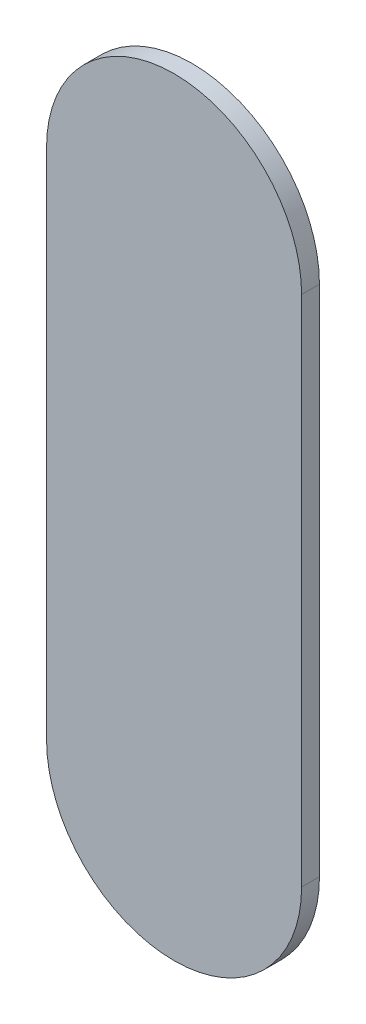
ISO-10303-21;
HEADER;
FILE_DESCRIPTION(('STEP AP214'),'2;1');
FILE_NAME('part.step','',(''),(''),'','','');
FILE_SCHEMA(('AUTOMOTIVE_DESIGN { 1 0 10303 214 1 1 1 1 }'));
ENDSEC;
DATA;
#1=APPLICATION_CONTEXT('core data for automotive mechanical design processes');
#2=APPLICATION_PROTOCOL_DEFINITION('international standard','automotive_design',2000,#1);
#3=PRODUCT_CONTEXT('',#1,'mechanical');
#4=PRODUCT('Part','Part','',(#3));
#5=PRODUCT_RELATED_PRODUCT_CATEGORY('part','',(#4));
#6=PRODUCT_DEFINITION_FORMATION('','',#4);
#7=PRODUCT_DEFINITION_CONTEXT('part definition',#1,'design');
#8=PRODUCT_DEFINITION('design','',#6,#7);
#9=PRODUCT_DEFINITION_SHAPE('','',#8);
#10=(LENGTH_UNIT() NAMED_UNIT(*) SI_UNIT(.MILLI.,.METRE.));
#11=(NAMED_UNIT(*) PLANE_ANGLE_UNIT() SI_UNIT($,.RADIAN.));
#12=(NAMED_UNIT(*) SI_UNIT($,.STERADIAN.) SOLID_ANGLE_UNIT());
#13=UNCERTAINTY_MEASURE_WITH_UNIT(LENGTH_MEASURE(1.E-05),#10,'distance_accuracy_value','');
#14=(GEOMETRIC_REPRESENTATION_CONTEXT(3) GLOBAL_UNCERTAINTY_ASSIGNED_CONTEXT((#13)) GLOBAL_UNIT_ASSIGNED_CONTEXT((#10,
#11,#12)) REPRESENTATION_CONTEXT('',''));
#15=CARTESIAN_POINT('',(0.,0.,0.));
#16=DIRECTION('',(0.,0.,1.));
#17=DIRECTION('',(1.,0.,0.));
#18=AXIS2_PLACEMENT_3D('',#15,#16,#17);
#19=CARTESIAN_POINT('',(115.27,-113.44,1.635));
#20=DIRECTION('',(0.,0.,1.));
#21=DIRECTION('',(1.,0.,0.));
#22=AXIS2_PLACEMENT_3D('',#19,#20,#21);
#23=PLANE('',#22);
#24=DIRECTION('',(0.,-1.,0.));
#25=VECTOR('',#24,1.);
#26=CARTESIAN_POINT('',(115.27,-113.44,1.635));
#27=LINE('',#26,#25);
#28=CARTESIAN_POINT('',(115.27,-113.44,1.635));
#29=VERTEX_POINT('',#28);
#30=CARTESIAN_POINT('',(115.27,-114.446,1.635));
#31=VERTEX_POINT('',#30);
#32=EDGE_CURVE('E72',#29,#31,#27,.T.);
#33=ORIENTED_EDGE('',*,*,#32,.T.);
#34=CARTESIAN_POINT('',(115.52,-114.446,1.635));
#35=DIRECTION('',(0.,0.,1.));
#36=DIRECTION('',(-1.,0.,0.));
#37=AXIS2_PLACEMENT_3D('',#34,#35,#36);
#38=CIRCLE('',#37,0.25);
#39=CARTESIAN_POINT('',(115.77,-114.446,1.635));
#40=VERTEX_POINT('',#39);
#41=EDGE_CURVE('E70',#31,#40,#38,.T.);
#42=ORIENTED_EDGE('',*,*,#41,.T.);
#43=DIRECTION('',(0.,1.,0.));
#44=VECTOR('',#43,1.);
#45=CARTESIAN_POINT('',(115.77,-114.446,1.635));
#46=LINE('',#45,#44);
#47=CARTESIAN_POINT('',(115.77,-113.44,1.635));
#48=VERTEX_POINT('',#47);
#49=EDGE_CURVE('E57',#40,#48,#46,.T.);
#50=ORIENTED_EDGE('',*,*,#49,.T.);
#51=CARTESIAN_POINT('',(115.52,-113.44,1.635));
#52=DIRECTION('',(0.,0.,1.));
#53=DIRECTION('',(1.,0.,0.));
#54=AXIS2_PLACEMENT_3D('',#51,#52,#53);
#55=CIRCLE('',#54,0.25);
#56=EDGE_CURVE('E11',#48,#29,#55,.T.);
#57=ORIENTED_EDGE('',*,*,#56,.T.);
#58=EDGE_LOOP('',(#33,#42,#50,#57));
#59=FACE_BOUND('',#58,.T.);
#60=ADVANCED_FACE('F17',(#59),#23,.T.);
#61=CARTESIAN_POINT('',(115.27,-113.44,1.6));
#62=DIRECTION('',(0.,0.,1.));
#63=DIRECTION('',(1.,0.,0.));
#64=AXIS2_PLACEMENT_3D('',#61,#62,#63);
#65=PLANE('',#64);
#66=CARTESIAN_POINT('',(115.52,-113.44,1.6));
#67=DIRECTION('',(0.,0.,1.));
#68=DIRECTION('',(1.,0.,0.));
#69=AXIS2_PLACEMENT_3D('',#66,#67,#68);
#70=CIRCLE('',#69,0.25);
#71=CARTESIAN_POINT('',(115.77,-113.44,1.6));
#72=VERTEX_POINT('',#71);
#73=CARTESIAN_POINT('',(115.27,-113.44,1.6));
#74=VERTEX_POINT('',#73);
#75=EDGE_CURVE('E21',#72,#74,#70,.T.);
#76=ORIENTED_EDGE('',*,*,#75,.F.);
#77=DIRECTION('',(0.,1.,0.));
#78=VECTOR('',#77,1.);
#79=CARTESIAN_POINT('',(115.77,-114.446,1.6));
#80=LINE('',#79,#78);
#81=CARTESIAN_POINT('',(115.77,-114.446,1.6));
#82=VERTEX_POINT('',#81);
#83=EDGE_CURVE('E77',#82,#72,#80,.T.);
#84=ORIENTED_EDGE('',*,*,#83,.F.);
#85=CARTESIAN_POINT('',(115.52,-114.446,1.6));
#86=DIRECTION('',(0.,0.,1.));
#87=DIRECTION('',(-1.,0.,0.));
#88=AXIS2_PLACEMENT_3D('',#85,#86,#87);
#89=CIRCLE('',#88,0.25);
#90=CARTESIAN_POINT('',(115.27,-114.446,1.6));
#91=VERTEX_POINT('',#90);
#92=EDGE_CURVE('E81',#91,#82,#89,.T.);
#93=ORIENTED_EDGE('',*,*,#92,.F.);
#94=DIRECTION('',(0.,-1.,0.));
#95=VECTOR('',#94,1.);
#96=CARTESIAN_POINT('',(115.27,-113.44,1.6));
#97=LINE('',#96,#95);
#98=EDGE_CURVE('E128',#74,#91,#97,.T.);
#99=ORIENTED_EDGE('',*,*,#98,.F.);
#100=EDGE_LOOP('',(#76,#84,#93,#99));
#101=FACE_BOUND('',#100,.T.);
#102=ADVANCED_FACE('F19',(#101),#65,.F.);
#103=CARTESIAN_POINT('',(115.52,-113.44,1.6));
#104=DIRECTION('',(0.,0.,-1.));
#105=DIRECTION('',(1.,0.,0.));
#106=AXIS2_PLACEMENT_3D('',#103,#104,#105);
#107=CYLINDRICAL_SURFACE('',#106,0.25);
#108=ORIENTED_EDGE('',*,*,#75,.T.);
#109=DIRECTION('',(0.,0.,1.));
#110=VECTOR('',#109,1.);
#111=CARTESIAN_POINT('',(115.27,-113.44,1.6));
#112=LINE('',#111,#110);
#113=EDGE_CURVE('E88',#74,#29,#112,.T.);
#114=ORIENTED_EDGE('',*,*,#113,.T.);
#115=ORIENTED_EDGE('',*,*,#56,.F.);
#116=DIRECTION('',(0.,0.,1.));
#117=VECTOR('',#116,1.);
#118=CARTESIAN_POINT('',(115.77,-113.44,1.6));
#119=LINE('',#118,#117);
#120=EDGE_CURVE('E64',#72,#48,#119,.T.);
#121=ORIENTED_EDGE('',*,*,#120,.F.);
#122=EDGE_LOOP('',(#108,#114,#115,#121));
#123=FACE_BOUND('',#122,.T.);
#124=ADVANCED_FACE('F149',(#123),#107,.T.);
#125=CARTESIAN_POINT('',(115.77,-114.446,1.6));
#126=DIRECTION('',(-1.,0.,0.));
#127=DIRECTION('',(0.,0.,1.));
#128=AXIS2_PLACEMENT_3D('',#125,#126,#127);
#129=PLANE('',#128);
#130=ORIENTED_EDGE('',*,*,#83,.T.);
#131=ORIENTED_EDGE('',*,*,#120,.T.);
#132=ORIENTED_EDGE('',*,*,#49,.F.);
#133=DIRECTION('',(0.,0.,1.));
#134=VECTOR('',#133,1.);
#135=CARTESIAN_POINT('',(115.77,-114.446,1.6));
#136=LINE('',#135,#134);
#137=EDGE_CURVE('E62',#82,#40,#136,.T.);
#138=ORIENTED_EDGE('',*,*,#137,.F.);
#139=EDGE_LOOP('',(#130,#131,#132,#138));
#140=FACE_BOUND('',#139,.T.);
#141=ADVANCED_FACE('F60',(#140),#129,.F.);
#142=CARTESIAN_POINT('',(115.52,-114.446,1.6));
#143=DIRECTION('',(0.,0.,-1.));
#144=DIRECTION('',(-1.,0.,0.));
#145=AXIS2_PLACEMENT_3D('',#142,#143,#144);
#146=CYLINDRICAL_SURFACE('',#145,0.25);
#147=ORIENTED_EDGE('',*,*,#92,.T.);
#148=ORIENTED_EDGE('',*,*,#137,.T.);
#149=ORIENTED_EDGE('',*,*,#41,.F.);
#150=DIRECTION('',(0.,0.,1.));
#151=VECTOR('',#150,1.);
#152=CARTESIAN_POINT('',(115.27,-114.446,1.6));
#153=LINE('',#152,#151);
#154=EDGE_CURVE('E122',#91,#31,#153,.T.);
#155=ORIENTED_EDGE('',*,*,#154,.F.);
#156=EDGE_LOOP('',(#147,#148,#149,#155));
#157=FACE_BOUND('',#156,.T.);
#158=ADVANCED_FACE('F79',(#157),#146,.T.);
#159=CARTESIAN_POINT('',(115.27,-113.44,1.6));
#160=DIRECTION('',(1.,0.,0.));
#161=DIRECTION('',(0.,1.,0.));
#162=AXIS2_PLACEMENT_3D('',#159,#160,#161);
#163=PLANE('',#162);
#164=ORIENTED_EDGE('',*,*,#98,.T.);
#165=ORIENTED_EDGE('',*,*,#154,.T.);
#166=ORIENTED_EDGE('',*,*,#32,.F.);
#167=ORIENTED_EDGE('',*,*,#113,.F.);
#168=EDGE_LOOP('',(#164,#165,#166,#167));
#169=FACE_BOUND('',#168,.T.);
#170=ADVANCED_FACE('F140',(#169),#163,.F.);
#171=CLOSED_SHELL('',(#60,#102,#124,#141,#158,#170));
#172=MANIFOLD_SOLID_BREP('B1',#171);
#173=ADVANCED_BREP_SHAPE_REPRESENTATION('',(#18,#172),#14);
#174=SHAPE_DEFINITION_REPRESENTATION(#9,#173);
ENDSEC;
END-ISO-10303-21;
